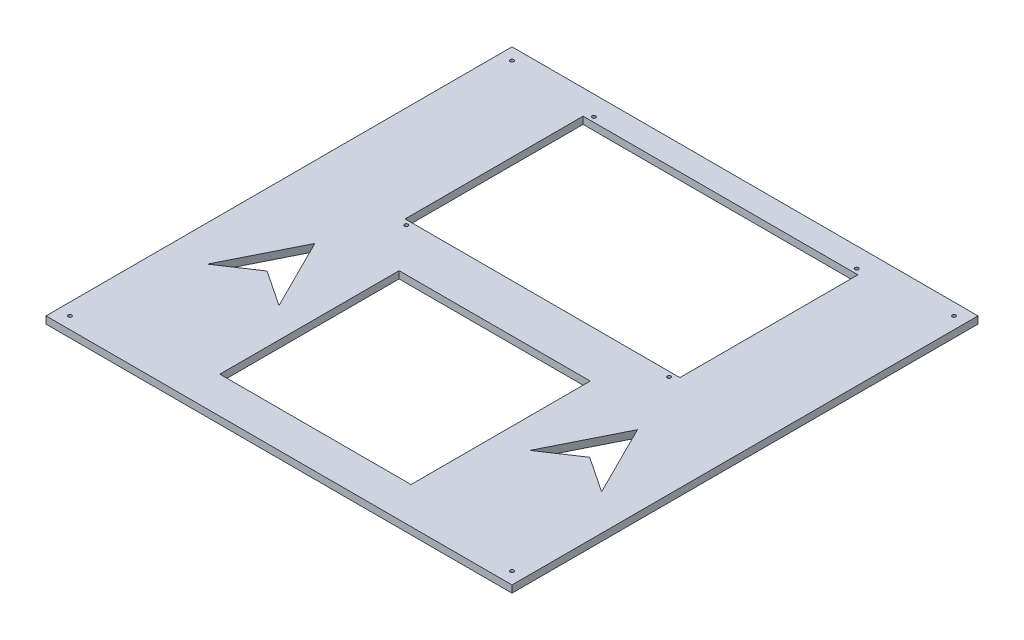
ISO-10303-21;
HEADER;
FILE_DESCRIPTION(('STEP AP214'),'2;1');
FILE_NAME('part.step','',(''),(''),'','','');
FILE_SCHEMA(('AUTOMOTIVE_DESIGN { 1 0 10303 214 1 1 1 1 }'));
ENDSEC;
DATA;
#1=APPLICATION_CONTEXT('core data for automotive mechanical design processes');
#2=APPLICATION_PROTOCOL_DEFINITION('international standard','automotive_design',2000,#1);
#3=PRODUCT_CONTEXT('',#1,'mechanical');
#4=PRODUCT('Part','Part','',(#3));
#5=PRODUCT_RELATED_PRODUCT_CATEGORY('part','',(#4));
#6=PRODUCT_DEFINITION_FORMATION('','',#4);
#7=PRODUCT_DEFINITION_CONTEXT('part definition',#1,'design');
#8=PRODUCT_DEFINITION('design','',#6,#7);
#9=PRODUCT_DEFINITION_SHAPE('','',#8);
#10=(LENGTH_UNIT() NAMED_UNIT(*) SI_UNIT(.MILLI.,.METRE.));
#11=(NAMED_UNIT(*) PLANE_ANGLE_UNIT() SI_UNIT($,.RADIAN.));
#12=(NAMED_UNIT(*) SI_UNIT($,.STERADIAN.) SOLID_ANGLE_UNIT());
#13=UNCERTAINTY_MEASURE_WITH_UNIT(LENGTH_MEASURE(1.E-05),#10,'distance_accuracy_value','');
#14=(GEOMETRIC_REPRESENTATION_CONTEXT(3) GLOBAL_UNCERTAINTY_ASSIGNED_CONTEXT((#13)) GLOBAL_UNIT_ASSIGNED_CONTEXT((#10,
#11,#12)) REPRESENTATION_CONTEXT('',''));
#15=CARTESIAN_POINT('',(0.,0.,0.));
#16=DIRECTION('',(0.,0.,1.));
#17=DIRECTION('',(1.,0.,0.));
#18=AXIS2_PLACEMENT_3D('',#15,#16,#17);
#19=CARTESIAN_POINT('',(0.,6.,0.));
#20=DIRECTION('',(0.,1.,0.));
#21=DIRECTION('',(0.,0.,1.));
#22=AXIS2_PLACEMENT_3D('',#19,#20,#21);
#23=PLANE('',#22);
#24=CARTESIAN_POINT('',(-185.,6.,185.));
#25=DIRECTION('',(0.,1.,0.));
#26=DIRECTION('',(0.,0.,1.));
#27=AXIS2_PLACEMENT_3D('',#24,#25,#26);
#28=CIRCLE('',#27,1.5);
#29=CARTESIAN_POINT('',(-185.,6.,186.5));
#30=VERTEX_POINT('',#29);
#31=EDGE_CURVE('E303',#30,#30,#28,.T.);
#32=ORIENTED_EDGE('',*,*,#31,.F.);
#33=EDGE_LOOP('',(#32));
#34=FACE_BOUND('',#33,.T.);
#35=CARTESIAN_POINT('',(-110.,6.,-21.5));
#36=DIRECTION('',(0.,1.,0.));
#37=DIRECTION('',(0.,0.,1.));
#38=AXIS2_PLACEMENT_3D('',#35,#36,#37);
#39=CIRCLE('',#38,1.5);
#40=CARTESIAN_POINT('',(-110.,6.,-20.));
#41=VERTEX_POINT('',#40);
#42=EDGE_CURVE('E304',#41,#41,#39,.T.);
#43=ORIENTED_EDGE('',*,*,#42,.F.);
#44=EDGE_LOOP('',(#43));
#45=FACE_BOUND('',#44,.T.);
#46=CARTESIAN_POINT('',(110.,6.,-21.5));
#47=DIRECTION('',(0.,1.,0.));
#48=DIRECTION('',(0.,0.,1.));
#49=AXIS2_PLACEMENT_3D('',#46,#47,#48);
#50=CIRCLE('',#49,1.5);
#51=CARTESIAN_POINT('',(110.,6.,-20.));
#52=VERTEX_POINT('',#51);
#53=EDGE_CURVE('E318',#52,#52,#50,.T.);
#54=ORIENTED_EDGE('',*,*,#53,.F.);
#55=EDGE_LOOP('',(#54));
#56=FACE_BOUND('',#55,.T.);
#57=CARTESIAN_POINT('',(185.,6.,185.));
#58=DIRECTION('',(0.,1.,0.));
#59=DIRECTION('',(0.,0.,1.));
#60=AXIS2_PLACEMENT_3D('',#57,#58,#59);
#61=CIRCLE('',#60,1.5);
#62=CARTESIAN_POINT('',(185.,6.,186.5));
#63=VERTEX_POINT('',#62);
#64=EDGE_CURVE('E547',#63,#63,#61,.T.);
#65=ORIENTED_EDGE('',*,*,#64,.F.);
#66=EDGE_LOOP('',(#65));
#67=FACE_BOUND('',#66,.T.);
#68=DIRECTION('',(1.,0.,0.));
#69=VECTOR('',#68,1.);
#70=CARTESIAN_POINT('',(-195.,6.,195.));
#71=LINE('',#70,#69);
#72=CARTESIAN_POINT('',(-195.,6.,195.));
#73=VERTEX_POINT('',#72);
#74=CARTESIAN_POINT('',(195.,6.,195.));
#75=VERTEX_POINT('',#74);
#76=EDGE_CURVE('E524',#73,#75,#71,.T.);
#77=ORIENTED_EDGE('',*,*,#76,.T.);
#78=DIRECTION('',(0.,0.,-1.));
#79=VECTOR('',#78,1.);
#80=CARTESIAN_POINT('',(195.,6.,195.));
#81=LINE('',#80,#79);
#82=CARTESIAN_POINT('',(195.,6.,-195.));
#83=VERTEX_POINT('',#82);
#84=EDGE_CURVE('E541',#75,#83,#81,.T.);
#85=ORIENTED_EDGE('',*,*,#84,.T.);
#86=DIRECTION('',(-1.,0.,0.));
#87=VECTOR('',#86,1.);
#88=CARTESIAN_POINT('',(195.,6.,-195.));
#89=LINE('',#88,#87);
#90=CARTESIAN_POINT('',(-195.,6.,-195.));
#91=VERTEX_POINT('',#90);
#92=EDGE_CURVE('E515',#83,#91,#89,.T.);
#93=ORIENTED_EDGE('',*,*,#92,.T.);
#94=DIRECTION('',(0.,0.,1.));
#95=VECTOR('',#94,1.);
#96=CARTESIAN_POINT('',(-195.,6.,-195.));
#97=LINE('',#96,#95);
#98=EDGE_CURVE('E532',#91,#73,#97,.T.);
#99=ORIENTED_EDGE('',*,*,#98,.T.);
#100=EDGE_LOOP('',(#77,#85,#93,#99));
#101=FACE_BOUND('',#100,.T.);
#102=CARTESIAN_POINT('',(-185.,6.,-185.));
#103=DIRECTION('',(0.,1.,0.));
#104=DIRECTION('',(0.,0.,1.));
#105=AXIS2_PLACEMENT_3D('',#102,#103,#104);
#106=CIRCLE('',#105,1.5);
#107=CARTESIAN_POINT('',(-185.,6.,-183.5));
#108=VERTEX_POINT('',#107);
#109=EDGE_CURVE('E332',#108,#108,#106,.T.);
#110=ORIENTED_EDGE('',*,*,#109,.F.);
#111=EDGE_LOOP('',(#110));
#112=FACE_BOUND('',#111,.T.);
#113=CARTESIAN_POINT('',(-110.,6.,-178.5));
#114=DIRECTION('',(0.,1.,0.));
#115=DIRECTION('',(0.,0.,1.));
#116=AXIS2_PLACEMENT_3D('',#113,#114,#115);
#117=CIRCLE('',#116,1.5);
#118=CARTESIAN_POINT('',(-110.,6.,-177.));
#119=VERTEX_POINT('',#118);
#120=EDGE_CURVE('E331',#119,#119,#117,.T.);
#121=ORIENTED_EDGE('',*,*,#120,.F.);
#122=EDGE_LOOP('',(#121));
#123=FACE_BOUND('',#122,.T.);
#124=DIRECTION('',(-1.,0.,0.));
#125=VECTOR('',#124,1.);
#126=CARTESIAN_POINT('',(115.,6.,-174.5));
#127=LINE('',#126,#125);
#128=CARTESIAN_POINT('',(115.,6.,-174.5));
#129=VERTEX_POINT('',#128);
#130=CARTESIAN_POINT('',(-115.,6.,-174.5));
#131=VERTEX_POINT('',#130);
#132=EDGE_CURVE('E437',#129,#131,#127,.T.);
#133=ORIENTED_EDGE('',*,*,#132,.F.);
#134=DIRECTION('',(0.,0.,-1.));
#135=VECTOR('',#134,1.);
#136=CARTESIAN_POINT('',(115.,6.,-25.5));
#137=LINE('',#136,#135);
#138=CARTESIAN_POINT('',(115.,6.,-25.5));
#139=VERTEX_POINT('',#138);
#140=EDGE_CURVE('E369',#139,#129,#137,.T.);
#141=ORIENTED_EDGE('',*,*,#140,.F.);
#142=DIRECTION('',(1.,0.,0.));
#143=VECTOR('',#142,1.);
#144=CARTESIAN_POINT('',(-115.,6.,-25.5));
#145=LINE('',#144,#143);
#146=CARTESIAN_POINT('',(-115.,6.,-25.5));
#147=VERTEX_POINT('',#146);
#148=EDGE_CURVE('E364',#147,#139,#145,.T.);
#149=ORIENTED_EDGE('',*,*,#148,.F.);
#150=DIRECTION('',(0.,0.,1.));
#151=VECTOR('',#150,1.);
#152=CARTESIAN_POINT('',(-115.,6.,-174.5));
#153=LINE('',#152,#151);
#154=EDGE_CURVE('E386',#131,#147,#153,.T.);
#155=ORIENTED_EDGE('',*,*,#154,.F.);
#156=EDGE_LOOP('',(#133,#141,#149,#155));
#157=FACE_BOUND('',#156,.T.);
#158=DIRECTION('',(1.,0.,0.));
#159=VECTOR('',#158,1.);
#160=CARTESIAN_POINT('',(-80.,6.,164.5));
#161=LINE('',#160,#159);
#162=CARTESIAN_POINT('',(-80.,6.,164.5));
#163=VERTEX_POINT('',#162);
#164=CARTESIAN_POINT('',(80.,6.,164.5));
#165=VERTEX_POINT('',#164);
#166=EDGE_CURVE('E394',#163,#165,#161,.T.);
#167=ORIENTED_EDGE('',*,*,#166,.F.);
#168=DIRECTION('',(0.,0.,1.));
#169=VECTOR('',#168,1.);
#170=CARTESIAN_POINT('',(-80.,6.,14.5000000000001));
#171=LINE('',#170,#169);
#172=CARTESIAN_POINT('',(-80.,6.,14.5000000000001));
#173=VERTEX_POINT('',#172);
#174=EDGE_CURVE('E398',#173,#163,#171,.T.);
#175=ORIENTED_EDGE('',*,*,#174,.F.);
#176=DIRECTION('',(-1.,0.,0.));
#177=VECTOR('',#176,1.);
#178=CARTESIAN_POINT('',(80.,6.,14.5000000000001));
#179=LINE('',#178,#177);
#180=CARTESIAN_POINT('',(80.,6.,14.5000000000001));
#181=VERTEX_POINT('',#180);
#182=EDGE_CURVE('E404',#181,#173,#179,.T.);
#183=ORIENTED_EDGE('',*,*,#182,.F.);
#184=DIRECTION('',(0.,0.,-1.));
#185=VECTOR('',#184,1.);
#186=CARTESIAN_POINT('',(80.,6.,14.5000000000001));
#187=LINE('',#186,#185);
#188=EDGE_CURVE('E397',#165,#181,#187,.T.);
#189=ORIENTED_EDGE('',*,*,#188,.F.);
#190=EDGE_LOOP('',(#167,#175,#183,#189));
#191=FACE_BOUND('',#190,.T.);
#192=CARTESIAN_POINT('',(110.,6.,-178.5));
#193=DIRECTION('',(0.,1.,0.));
#194=DIRECTION('',(0.,0.,1.));
#195=AXIS2_PLACEMENT_3D('',#192,#193,#194);
#196=CIRCLE('',#195,1.5);
#197=CARTESIAN_POINT('',(110.,6.,-177.));
#198=VERTEX_POINT('',#197);
#199=EDGE_CURVE('E292',#198,#198,#196,.T.);
#200=ORIENTED_EDGE('',*,*,#199,.F.);
#201=EDGE_LOOP('',(#200));
#202=FACE_BOUND('',#201,.T.);
#203=CARTESIAN_POINT('',(185.,6.,-185.));
#204=DIRECTION('',(0.,1.,0.));
#205=DIRECTION('',(0.,0.,1.));
#206=AXIS2_PLACEMENT_3D('',#203,#204,#205);
#207=CIRCLE('',#206,1.5);
#208=CARTESIAN_POINT('',(185.,6.,-183.5));
#209=VERTEX_POINT('',#208);
#210=EDGE_CURVE('E280',#209,#209,#207,.T.);
#211=ORIENTED_EDGE('',*,*,#210,.F.);
#212=EDGE_LOOP('',(#211));
#213=FACE_BOUND('',#212,.T.);
#214=DIRECTION('',(0.832050294337844,0.,0.554700196225229));
#215=VECTOR('',#214,1.);
#216=CARTESIAN_POINT('',(-135.,6.,70.));
#217=LINE('',#216,#215);
#218=CARTESIAN_POINT('',(-135.,6.,70.));
#219=VERTEX_POINT('',#218);
#220=CARTESIAN_POINT('',(-105.,6.,90.));
#221=VERTEX_POINT('',#220);
#222=EDGE_CURVE('E238',#219,#221,#217,.T.);
#223=ORIENTED_EDGE('',*,*,#222,.F.);
#224=DIRECTION('',(0.832050294337844,0.,-0.554700196225229));
#225=VECTOR('',#224,1.);
#226=CARTESIAN_POINT('',(-165.,6.,90.));
#227=LINE('',#226,#225);
#228=CARTESIAN_POINT('',(-165.,6.,90.));
#229=VERTEX_POINT('',#228);
#230=EDGE_CURVE('E234',#229,#219,#227,.T.);
#231=ORIENTED_EDGE('',*,*,#230,.F.);
#232=DIRECTION('',(-0.447213595499958,0.,0.894427190999916));
#233=VECTOR('',#232,1.);
#234=CARTESIAN_POINT('',(-135.,6.,30.));
#235=LINE('',#234,#233);
#236=CARTESIAN_POINT('',(-135.,6.,30.));
#237=VERTEX_POINT('',#236);
#238=EDGE_CURVE('E245',#237,#229,#235,.T.);
#239=ORIENTED_EDGE('',*,*,#238,.F.);
#240=DIRECTION('',(-0.447213595499958,0.,-0.894427190999916));
#241=VECTOR('',#240,1.);
#242=CARTESIAN_POINT('',(-105.,6.,90.));
#243=LINE('',#242,#241);
#244=EDGE_CURVE('E250',#221,#237,#243,.T.);
#245=ORIENTED_EDGE('',*,*,#244,.F.);
#246=EDGE_LOOP('',(#223,#231,#239,#245));
#247=FACE_BOUND('',#246,.T.);
#248=DIRECTION('',(0.832050294337844,0.,0.554700196225229));
#249=VECTOR('',#248,1.);
#250=CARTESIAN_POINT('',(135.,6.,70.));
#251=LINE('',#250,#249);
#252=CARTESIAN_POINT('',(135.,6.,70.));
#253=VERTEX_POINT('',#252);
#254=CARTESIAN_POINT('',(165.,6.,90.));
#255=VERTEX_POINT('',#254);
#256=EDGE_CURVE('E187',#253,#255,#251,.T.);
#257=ORIENTED_EDGE('',*,*,#256,.F.);
#258=DIRECTION('',(0.832050294337844,0.,-0.554700196225229));
#259=VECTOR('',#258,1.);
#260=CARTESIAN_POINT('',(105.,6.,90.));
#261=LINE('',#260,#259);
#262=CARTESIAN_POINT('',(105.,6.,90.));
#263=VERTEX_POINT('',#262);
#264=EDGE_CURVE('E178',#263,#253,#261,.T.);
#265=ORIENTED_EDGE('',*,*,#264,.F.);
#266=DIRECTION('',(-0.447213595499958,0.,0.894427190999916));
#267=VECTOR('',#266,1.);
#268=CARTESIAN_POINT('',(135.,6.,30.));
#269=LINE('',#268,#267);
#270=CARTESIAN_POINT('',(135.,6.,30.));
#271=VERTEX_POINT('',#270);
#272=EDGE_CURVE('E204',#271,#263,#269,.T.);
#273=ORIENTED_EDGE('',*,*,#272,.F.);
#274=DIRECTION('',(-0.447213595499958,0.,-0.894427190999916));
#275=VECTOR('',#274,1.);
#276=CARTESIAN_POINT('',(165.,6.,90.));
#277=LINE('',#276,#275);
#278=EDGE_CURVE('E200',#255,#271,#277,.T.);
#279=ORIENTED_EDGE('',*,*,#278,.F.);
#280=EDGE_LOOP('',(#257,#265,#273,#279));
#281=FACE_BOUND('',#280,.T.);
#282=ADVANCED_FACE('F40',(#34,#45,#56,#67,#101,#112,#123,#157,#191,#202,#213,#247,#281),#23,.T.);
#283=CARTESIAN_POINT('',(0.,0.,0.));
#284=DIRECTION('',(0.,1.,0.));
#285=DIRECTION('',(0.,0.,1.));
#286=AXIS2_PLACEMENT_3D('',#283,#284,#285);
#287=PLANE('',#286);
#288=DIRECTION('',(0.832050294337844,0.,-0.554700196225229));
#289=VECTOR('',#288,1.);
#290=CARTESIAN_POINT('',(-165.,0.,90.));
#291=LINE('',#290,#289);
#292=CARTESIAN_POINT('',(-165.,0.,90.));
#293=VERTEX_POINT('',#292);
#294=CARTESIAN_POINT('',(-135.,0.,70.));
#295=VERTEX_POINT('',#294);
#296=EDGE_CURVE('E196',#293,#295,#291,.T.);
#297=ORIENTED_EDGE('',*,*,#296,.T.);
#298=DIRECTION('',(0.832050294337844,0.,0.554700196225229));
#299=VECTOR('',#298,1.);
#300=CARTESIAN_POINT('',(-135.,0.,70.));
#301=LINE('',#300,#299);
#302=CARTESIAN_POINT('',(-105.,0.,90.));
#303=VERTEX_POINT('',#302);
#304=EDGE_CURVE('E255',#295,#303,#301,.T.);
#305=ORIENTED_EDGE('',*,*,#304,.T.);
#306=DIRECTION('',(-0.447213595499958,0.,-0.894427190999916));
#307=VECTOR('',#306,1.);
#308=CARTESIAN_POINT('',(-105.,0.,90.));
#309=LINE('',#308,#307);
#310=CARTESIAN_POINT('',(-135.,0.,30.));
#311=VERTEX_POINT('',#310);
#312=EDGE_CURVE('E259',#303,#311,#309,.T.);
#313=ORIENTED_EDGE('',*,*,#312,.T.);
#314=DIRECTION('',(-0.447213595499958,0.,0.894427190999916));
#315=VECTOR('',#314,1.);
#316=CARTESIAN_POINT('',(-135.,0.,30.));
#317=LINE('',#316,#315);
#318=EDGE_CURVE('E239',#311,#293,#317,.T.);
#319=ORIENTED_EDGE('',*,*,#318,.T.);
#320=EDGE_LOOP('',(#297,#305,#313,#319));
#321=FACE_BOUND('',#320,.T.);
#322=DIRECTION('',(0.,0.,-1.));
#323=VECTOR('',#322,1.);
#324=CARTESIAN_POINT('',(115.,0.,-25.5));
#325=LINE('',#324,#323);
#326=CARTESIAN_POINT('',(115.,0.,-25.5));
#327=VERTEX_POINT('',#326);
#328=CARTESIAN_POINT('',(115.,0.,-174.5));
#329=VERTEX_POINT('',#328);
#330=EDGE_CURVE('E378',#327,#329,#325,.T.);
#331=ORIENTED_EDGE('',*,*,#330,.T.);
#332=DIRECTION('',(-1.,0.,0.));
#333=VECTOR('',#332,1.);
#334=CARTESIAN_POINT('',(115.,0.,-174.5));
#335=LINE('',#334,#333);
#336=CARTESIAN_POINT('',(-115.,0.,-174.5));
#337=VERTEX_POINT('',#336);
#338=EDGE_CURVE('E374',#329,#337,#335,.T.);
#339=ORIENTED_EDGE('',*,*,#338,.T.);
#340=DIRECTION('',(0.,0.,1.));
#341=VECTOR('',#340,1.);
#342=CARTESIAN_POINT('',(-115.,0.,-174.5));
#343=LINE('',#342,#341);
#344=CARTESIAN_POINT('',(-115.,0.,-25.5));
#345=VERTEX_POINT('',#344);
#346=EDGE_CURVE('E370',#337,#345,#343,.T.);
#347=ORIENTED_EDGE('',*,*,#346,.T.);
#348=DIRECTION('',(1.,0.,0.));
#349=VECTOR('',#348,1.);
#350=CARTESIAN_POINT('',(-115.,0.,-25.5));
#351=LINE('',#350,#349);
#352=EDGE_CURVE('E365',#345,#327,#351,.T.);
#353=ORIENTED_EDGE('',*,*,#352,.T.);
#354=EDGE_LOOP('',(#331,#339,#347,#353));
#355=FACE_BOUND('',#354,.T.);
#356=DIRECTION('',(1.,0.,0.));
#357=VECTOR('',#356,1.);
#358=CARTESIAN_POINT('',(-195.,0.,195.));
#359=LINE('',#358,#357);
#360=CARTESIAN_POINT('',(-195.,0.,195.));
#361=VERTEX_POINT('',#360);
#362=CARTESIAN_POINT('',(195.,0.,195.));
#363=VERTEX_POINT('',#362);
#364=EDGE_CURVE('E511',#361,#363,#359,.T.);
#365=ORIENTED_EDGE('',*,*,#364,.F.);
#366=DIRECTION('',(0.,0.,1.));
#367=VECTOR('',#366,1.);
#368=CARTESIAN_POINT('',(-195.,0.,-195.));
#369=LINE('',#368,#367);
#370=CARTESIAN_POINT('',(-195.,0.,-195.));
#371=VERTEX_POINT('',#370);
#372=EDGE_CURVE('E520',#371,#361,#369,.T.);
#373=ORIENTED_EDGE('',*,*,#372,.F.);
#374=DIRECTION('',(-1.,0.,0.));
#375=VECTOR('',#374,1.);
#376=CARTESIAN_POINT('',(195.,0.,-195.));
#377=LINE('',#376,#375);
#378=CARTESIAN_POINT('',(195.,0.,-195.));
#379=VERTEX_POINT('',#378);
#380=EDGE_CURVE('E510',#379,#371,#377,.T.);
#381=ORIENTED_EDGE('',*,*,#380,.F.);
#382=DIRECTION('',(0.,0.,-1.));
#383=VECTOR('',#382,1.);
#384=CARTESIAN_POINT('',(195.,0.,195.));
#385=LINE('',#384,#383);
#386=EDGE_CURVE('E502',#363,#379,#385,.T.);
#387=ORIENTED_EDGE('',*,*,#386,.F.);
#388=EDGE_LOOP('',(#365,#373,#381,#387));
#389=FACE_BOUND('',#388,.T.);
#390=CARTESIAN_POINT('',(185.,0.,185.));
#391=DIRECTION('',(0.,1.,0.));
#392=DIRECTION('',(0.,0.,1.));
#393=AXIS2_PLACEMENT_3D('',#390,#391,#392);
#394=CIRCLE('',#393,1.5);
#395=CARTESIAN_POINT('',(185.,0.,186.5));
#396=VERTEX_POINT('',#395);
#397=EDGE_CURVE('E337',#396,#396,#394,.T.);
#398=ORIENTED_EDGE('',*,*,#397,.T.);
#399=EDGE_LOOP('',(#398));
#400=FACE_BOUND('',#399,.T.);
#401=CARTESIAN_POINT('',(-185.,0.,-185.));
#402=DIRECTION('',(0.,1.,0.));
#403=DIRECTION('',(0.,0.,1.));
#404=AXIS2_PLACEMENT_3D('',#401,#402,#403);
#405=CIRCLE('',#404,1.5);
#406=CARTESIAN_POINT('',(-185.,0.,-183.5));
#407=VERTEX_POINT('',#406);
#408=EDGE_CURVE('E324',#407,#407,#405,.T.);
#409=ORIENTED_EDGE('',*,*,#408,.T.);
#410=EDGE_LOOP('',(#409));
#411=FACE_BOUND('',#410,.T.);
#412=CARTESIAN_POINT('',(110.,0.,-21.5));
#413=DIRECTION('',(0.,1.,0.));
#414=DIRECTION('',(0.,0.,1.));
#415=AXIS2_PLACEMENT_3D('',#412,#413,#414);
#416=CIRCLE('',#415,1.5);
#417=CARTESIAN_POINT('',(110.,0.,-20.));
#418=VERTEX_POINT('',#417);
#419=EDGE_CURVE('E325',#418,#418,#416,.T.);
#420=ORIENTED_EDGE('',*,*,#419,.T.);
#421=EDGE_LOOP('',(#420));
#422=FACE_BOUND('',#421,.T.);
#423=CARTESIAN_POINT('',(-110.,0.,-178.5));
#424=DIRECTION('',(0.,1.,0.));
#425=DIRECTION('',(0.,0.,1.));
#426=AXIS2_PLACEMENT_3D('',#423,#424,#425);
#427=CIRCLE('',#426,1.5);
#428=CARTESIAN_POINT('',(-110.,0.,-177.));
#429=VERTEX_POINT('',#428);
#430=EDGE_CURVE('E326',#429,#429,#427,.T.);
#431=ORIENTED_EDGE('',*,*,#430,.T.);
#432=EDGE_LOOP('',(#431));
#433=FACE_BOUND('',#432,.T.);
#434=DIRECTION('',(0.,0.,1.));
#435=VECTOR('',#434,1.);
#436=CARTESIAN_POINT('',(-80.,0.,14.5000000000001));
#437=LINE('',#436,#435);
#438=CARTESIAN_POINT('',(-80.,0.,14.5000000000001));
#439=VERTEX_POINT('',#438);
#440=CARTESIAN_POINT('',(-80.,0.,164.5));
#441=VERTEX_POINT('',#440);
#442=EDGE_CURVE('E309',#439,#441,#437,.T.);
#443=ORIENTED_EDGE('',*,*,#442,.T.);
#444=DIRECTION('',(1.,0.,0.));
#445=VECTOR('',#444,1.);
#446=CARTESIAN_POINT('',(-80.,0.,164.5));
#447=LINE('',#446,#445);
#448=CARTESIAN_POINT('',(80.,0.,164.5));
#449=VERTEX_POINT('',#448);
#450=EDGE_CURVE('E412',#441,#449,#447,.T.);
#451=ORIENTED_EDGE('',*,*,#450,.T.);
#452=DIRECTION('',(0.,0.,-1.));
#453=VECTOR('',#452,1.);
#454=CARTESIAN_POINT('',(80.,0.,14.5000000000001));
#455=LINE('',#454,#453);
#456=CARTESIAN_POINT('',(80.,0.,14.5000000000001));
#457=VERTEX_POINT('',#456);
#458=EDGE_CURVE('E416',#449,#457,#455,.T.);
#459=ORIENTED_EDGE('',*,*,#458,.T.);
#460=DIRECTION('',(-1.,0.,0.));
#461=VECTOR('',#460,1.);
#462=CARTESIAN_POINT('',(80.,0.,14.5000000000001));
#463=LINE('',#462,#461);
#464=EDGE_CURVE('E420',#457,#439,#463,.T.);
#465=ORIENTED_EDGE('',*,*,#464,.T.);
#466=EDGE_LOOP('',(#443,#451,#459,#465));
#467=FACE_BOUND('',#466,.T.);
#468=CARTESIAN_POINT('',(-110.,0.,-21.5));
#469=DIRECTION('',(0.,1.,0.));
#470=DIRECTION('',(0.,0.,1.));
#471=AXIS2_PLACEMENT_3D('',#468,#469,#470);
#472=CIRCLE('',#471,1.5);
#473=CARTESIAN_POINT('',(-110.,0.,-20.));
#474=VERTEX_POINT('',#473);
#475=EDGE_CURVE('E298',#474,#474,#472,.T.);
#476=ORIENTED_EDGE('',*,*,#475,.T.);
#477=EDGE_LOOP('',(#476));
#478=FACE_BOUND('',#477,.T.);
#479=CARTESIAN_POINT('',(110.,0.,-178.5));
#480=DIRECTION('',(0.,1.,0.));
#481=DIRECTION('',(0.,0.,1.));
#482=AXIS2_PLACEMENT_3D('',#479,#480,#481);
#483=CIRCLE('',#482,1.5);
#484=CARTESIAN_POINT('',(110.,0.,-177.));
#485=VERTEX_POINT('',#484);
#486=EDGE_CURVE('E299',#485,#485,#483,.T.);
#487=ORIENTED_EDGE('',*,*,#486,.T.);
#488=EDGE_LOOP('',(#487));
#489=FACE_BOUND('',#488,.T.);
#490=CARTESIAN_POINT('',(-185.,0.,185.));
#491=DIRECTION('',(0.,1.,0.));
#492=DIRECTION('',(0.,0.,1.));
#493=AXIS2_PLACEMENT_3D('',#490,#491,#492);
#494=CIRCLE('',#493,1.5);
#495=CARTESIAN_POINT('',(-185.,0.,186.5));
#496=VERTEX_POINT('',#495);
#497=EDGE_CURVE('E285',#496,#496,#494,.T.);
#498=ORIENTED_EDGE('',*,*,#497,.T.);
#499=EDGE_LOOP('',(#498));
#500=FACE_BOUND('',#499,.T.);
#501=CARTESIAN_POINT('',(185.,0.,-185.));
#502=DIRECTION('',(0.,1.,0.));
#503=DIRECTION('',(0.,0.,1.));
#504=AXIS2_PLACEMENT_3D('',#501,#502,#503);
#505=CIRCLE('',#504,1.5);
#506=CARTESIAN_POINT('',(185.,0.,-183.5));
#507=VERTEX_POINT('',#506);
#508=EDGE_CURVE('E279',#507,#507,#505,.T.);
#509=ORIENTED_EDGE('',*,*,#508,.T.);
#510=EDGE_LOOP('',(#509));
#511=FACE_BOUND('',#510,.T.);
#512=DIRECTION('',(0.832050294337844,0.,-0.554700196225229));
#513=VECTOR('',#512,1.);
#514=CARTESIAN_POINT('',(105.,0.,90.));
#515=LINE('',#514,#513);
#516=CARTESIAN_POINT('',(105.,0.,90.));
#517=VERTEX_POINT('',#516);
#518=CARTESIAN_POINT('',(135.,0.,70.));
#519=VERTEX_POINT('',#518);
#520=EDGE_CURVE('E64',#517,#519,#515,.T.);
#521=ORIENTED_EDGE('',*,*,#520,.T.);
#522=DIRECTION('',(0.832050294337844,0.,0.554700196225229));
#523=VECTOR('',#522,1.);
#524=CARTESIAN_POINT('',(135.,0.,70.));
#525=LINE('',#524,#523);
#526=CARTESIAN_POINT('',(165.,0.,90.));
#527=VERTEX_POINT('',#526);
#528=EDGE_CURVE('E194',#519,#527,#525,.T.);
#529=ORIENTED_EDGE('',*,*,#528,.T.);
#530=DIRECTION('',(-0.447213595499958,0.,-0.894427190999916));
#531=VECTOR('',#530,1.);
#532=CARTESIAN_POINT('',(165.,0.,90.));
#533=LINE('',#532,#531);
#534=CARTESIAN_POINT('',(135.,0.,30.));
#535=VERTEX_POINT('',#534);
#536=EDGE_CURVE('E221',#527,#535,#533,.T.);
#537=ORIENTED_EDGE('',*,*,#536,.T.);
#538=DIRECTION('',(-0.447213595499958,0.,0.894427190999916));
#539=VECTOR('',#538,1.);
#540=CARTESIAN_POINT('',(135.,0.,30.));
#541=LINE('',#540,#539);
#542=EDGE_CURVE('E188',#535,#517,#541,.T.);
#543=ORIENTED_EDGE('',*,*,#542,.T.);
#544=EDGE_LOOP('',(#521,#529,#537,#543));
#545=FACE_BOUND('',#544,.T.);
#546=ADVANCED_FACE('F461',(#321,#355,#389,#400,#411,#422,#433,#467,#478,#489,#500,#511,#545),
#287,.F.);
#547=CARTESIAN_POINT('',(-195.,6.,195.));
#548=DIRECTION('',(0.,0.,-1.));
#549=DIRECTION('',(-1.,0.,0.));
#550=AXIS2_PLACEMENT_3D('',#547,#548,#549);
#551=PLANE('',#550);
#552=ORIENTED_EDGE('',*,*,#364,.T.);
#553=DIRECTION('',(0.,-1.,0.));
#554=VECTOR('',#553,1.);
#555=CARTESIAN_POINT('',(195.,6.,195.));
#556=LINE('',#555,#554);
#557=EDGE_CURVE('E12',#75,#363,#556,.T.);
#558=ORIENTED_EDGE('',*,*,#557,.F.);
#559=ORIENTED_EDGE('',*,*,#76,.F.);
#560=DIRECTION('',(0.,-1.,0.));
#561=VECTOR('',#560,1.);
#562=CARTESIAN_POINT('',(-195.,6.,195.));
#563=LINE('',#562,#561);
#564=EDGE_CURVE('E528',#73,#361,#563,.T.);
#565=ORIENTED_EDGE('',*,*,#564,.T.);
#566=EDGE_LOOP('',(#552,#558,#559,#565));
#567=FACE_BOUND('',#566,.T.);
#568=ADVANCED_FACE('F42',(#567),#551,.F.);
#569=CARTESIAN_POINT('',(195.,6.,195.));
#570=DIRECTION('',(-1.,0.,0.));
#571=DIRECTION('',(0.,0.,1.));
#572=AXIS2_PLACEMENT_3D('',#569,#570,#571);
#573=PLANE('',#572);
#574=ORIENTED_EDGE('',*,*,#386,.T.);
#575=DIRECTION('',(0.,-1.,0.));
#576=VECTOR('',#575,1.);
#577=CARTESIAN_POINT('',(195.,6.,-195.));
#578=LINE('',#577,#576);
#579=EDGE_CURVE('E49',#83,#379,#578,.T.);
#580=ORIENTED_EDGE('',*,*,#579,.F.);
#581=ORIENTED_EDGE('',*,*,#84,.F.);
#582=ORIENTED_EDGE('',*,*,#557,.T.);
#583=EDGE_LOOP('',(#574,#580,#581,#582));
#584=FACE_BOUND('',#583,.T.);
#585=ADVANCED_FACE('F493',(#584),#573,.F.);
#586=CARTESIAN_POINT('',(195.,6.,-195.));
#587=DIRECTION('',(0.,0.,1.));
#588=DIRECTION('',(1.,0.,0.));
#589=AXIS2_PLACEMENT_3D('',#586,#587,#588);
#590=PLANE('',#589);
#591=ORIENTED_EDGE('',*,*,#380,.T.);
#592=DIRECTION('',(0.,-1.,0.));
#593=VECTOR('',#592,1.);
#594=CARTESIAN_POINT('',(-195.,6.,-195.));
#595=LINE('',#594,#593);
#596=EDGE_CURVE('E517',#91,#371,#595,.T.);
#597=ORIENTED_EDGE('',*,*,#596,.F.);
#598=ORIENTED_EDGE('',*,*,#92,.F.);
#599=ORIENTED_EDGE('',*,*,#579,.T.);
#600=EDGE_LOOP('',(#591,#597,#598,#599));
#601=FACE_BOUND('',#600,.T.);
#602=ADVANCED_FACE('F490',(#601),#590,.F.);
#603=CARTESIAN_POINT('',(-195.,6.,-195.));
#604=DIRECTION('',(1.,0.,0.));
#605=DIRECTION('',(0.,0.,-1.));
#606=AXIS2_PLACEMENT_3D('',#603,#604,#605);
#607=PLANE('',#606);
#608=ORIENTED_EDGE('',*,*,#372,.T.);
#609=ORIENTED_EDGE('',*,*,#564,.F.);
#610=ORIENTED_EDGE('',*,*,#98,.F.);
#611=ORIENTED_EDGE('',*,*,#596,.T.);
#612=EDGE_LOOP('',(#608,#609,#610,#611));
#613=FACE_BOUND('',#612,.T.);
#614=ADVANCED_FACE('F487',(#613),#607,.F.);
#615=CARTESIAN_POINT('',(185.,6.,185.));
#616=DIRECTION('',(0.,-1.,0.));
#617=DIRECTION('',(0.,0.,-1.));
#618=AXIS2_PLACEMENT_3D('',#615,#616,#617);
#619=CYLINDRICAL_SURFACE('',#618,1.5);
#620=ORIENTED_EDGE('',*,*,#64,.T.);
#621=EDGE_LOOP('',(#620));
#622=FACE_BOUND('',#621,.T.);
#623=ORIENTED_EDGE('',*,*,#397,.F.);
#624=EDGE_LOOP('',(#623));
#625=FACE_BOUND('',#624,.T.);
#626=ADVANCED_FACE('F484',(#622,#625),#619,.F.);
#627=CARTESIAN_POINT('',(-185.,6.,-185.));
#628=DIRECTION('',(0.,-1.,0.));
#629=DIRECTION('',(0.,0.,-1.));
#630=AXIS2_PLACEMENT_3D('',#627,#628,#629);
#631=CYLINDRICAL_SURFACE('',#630,1.5);
#632=ORIENTED_EDGE('',*,*,#109,.T.);
#633=EDGE_LOOP('',(#632));
#634=FACE_BOUND('',#633,.T.);
#635=ORIENTED_EDGE('',*,*,#408,.F.);
#636=EDGE_LOOP('',(#635));
#637=FACE_BOUND('',#636,.T.);
#638=ADVANCED_FACE('F581',(#634,#637),#631,.F.);
#639=CARTESIAN_POINT('',(110.,6.,-21.5));
#640=DIRECTION('',(0.,-1.,0.));
#641=DIRECTION('',(0.,0.,-1.));
#642=AXIS2_PLACEMENT_3D('',#639,#640,#641);
#643=CYLINDRICAL_SURFACE('',#642,1.5);
#644=ORIENTED_EDGE('',*,*,#53,.T.);
#645=EDGE_LOOP('',(#644));
#646=FACE_BOUND('',#645,.T.);
#647=ORIENTED_EDGE('',*,*,#419,.F.);
#648=EDGE_LOOP('',(#647));
#649=FACE_BOUND('',#648,.T.);
#650=ADVANCED_FACE('F569',(#646,#649),#643,.F.);
#651=CARTESIAN_POINT('',(-110.,6.,-178.5));
#652=DIRECTION('',(0.,-1.,0.));
#653=DIRECTION('',(0.,0.,-1.));
#654=AXIS2_PLACEMENT_3D('',#651,#652,#653);
#655=CYLINDRICAL_SURFACE('',#654,1.5);
#656=ORIENTED_EDGE('',*,*,#120,.T.);
#657=EDGE_LOOP('',(#656));
#658=FACE_BOUND('',#657,.T.);
#659=ORIENTED_EDGE('',*,*,#430,.F.);
#660=EDGE_LOOP('',(#659));
#661=FACE_BOUND('',#660,.T.);
#662=ADVANCED_FACE('F471',(#658,#661),#655,.F.);
#663=CARTESIAN_POINT('',(115.,6.,-25.5));
#664=DIRECTION('',(-1.,0.,0.));
#665=DIRECTION('',(0.,0.,1.));
#666=AXIS2_PLACEMENT_3D('',#663,#664,#665);
#667=PLANE('',#666);
#668=ORIENTED_EDGE('',*,*,#330,.F.);
#669=DIRECTION('',(0.,-1.,0.));
#670=VECTOR('',#669,1.);
#671=CARTESIAN_POINT('',(115.,6.,-25.5));
#672=LINE('',#671,#670);
#673=EDGE_CURVE('E360',#139,#327,#672,.T.);
#674=ORIENTED_EDGE('',*,*,#673,.F.);
#675=ORIENTED_EDGE('',*,*,#140,.T.);
#676=DIRECTION('',(0.,-1.,0.));
#677=VECTOR('',#676,1.);
#678=CARTESIAN_POINT('',(115.,6.,-174.5));
#679=LINE('',#678,#677);
#680=EDGE_CURVE('E350',#129,#329,#679,.T.);
#681=ORIENTED_EDGE('',*,*,#680,.T.);
#682=EDGE_LOOP('',(#668,#674,#675,#681));
#683=FACE_BOUND('',#682,.T.);
#684=ADVANCED_FACE('F459',(#683),#667,.T.);
#685=CARTESIAN_POINT('',(115.,6.,-174.5));
#686=DIRECTION('',(0.,0.,1.));
#687=DIRECTION('',(1.,0.,0.));
#688=AXIS2_PLACEMENT_3D('',#685,#686,#687);
#689=PLANE('',#688);
#690=ORIENTED_EDGE('',*,*,#338,.F.);
#691=ORIENTED_EDGE('',*,*,#680,.F.);
#692=ORIENTED_EDGE('',*,*,#132,.T.);
#693=DIRECTION('',(0.,-1.,0.));
#694=VECTOR('',#693,1.);
#695=CARTESIAN_POINT('',(-115.,6.,-174.5));
#696=LINE('',#695,#694);
#697=EDGE_CURVE('E354',#131,#337,#696,.T.);
#698=ORIENTED_EDGE('',*,*,#697,.T.);
#699=EDGE_LOOP('',(#690,#691,#692,#698));
#700=FACE_BOUND('',#699,.T.);
#701=ADVANCED_FACE('F463',(#700),#689,.T.);
#702=CARTESIAN_POINT('',(-115.,6.,-174.5));
#703=DIRECTION('',(1.,0.,0.));
#704=DIRECTION('',(0.,0.,-1.));
#705=AXIS2_PLACEMENT_3D('',#702,#703,#704);
#706=PLANE('',#705);
#707=ORIENTED_EDGE('',*,*,#346,.F.);
#708=ORIENTED_EDGE('',*,*,#697,.F.);
#709=ORIENTED_EDGE('',*,*,#154,.T.);
#710=DIRECTION('',(0.,-1.,0.));
#711=VECTOR('',#710,1.);
#712=CARTESIAN_POINT('',(-115.,6.,-25.5));
#713=LINE('',#712,#711);
#714=EDGE_CURVE('E357',#147,#345,#713,.T.);
#715=ORIENTED_EDGE('',*,*,#714,.T.);
#716=EDGE_LOOP('',(#707,#708,#709,#715));
#717=FACE_BOUND('',#716,.T.);
#718=ADVANCED_FACE('F450',(#717),#706,.T.);
#719=CARTESIAN_POINT('',(-115.,6.,-25.5));
#720=DIRECTION('',(0.,0.,-1.));
#721=DIRECTION('',(-1.,0.,0.));
#722=AXIS2_PLACEMENT_3D('',#719,#720,#721);
#723=PLANE('',#722);
#724=ORIENTED_EDGE('',*,*,#352,.F.);
#725=ORIENTED_EDGE('',*,*,#714,.F.);
#726=ORIENTED_EDGE('',*,*,#148,.T.);
#727=ORIENTED_EDGE('',*,*,#673,.T.);
#728=EDGE_LOOP('',(#724,#725,#726,#727));
#729=FACE_BOUND('',#728,.T.);
#730=ADVANCED_FACE('F457',(#729),#723,.T.);
#731=CARTESIAN_POINT('',(-80.,6.,14.5000000000001));
#732=DIRECTION('',(1.,0.,0.));
#733=DIRECTION('',(0.,0.,-1.));
#734=AXIS2_PLACEMENT_3D('',#731,#732,#733);
#735=PLANE('',#734);
#736=ORIENTED_EDGE('',*,*,#442,.F.);
#737=DIRECTION('',(0.,-1.,0.));
#738=VECTOR('',#737,1.);
#739=CARTESIAN_POINT('',(-80.,6.,14.5000000000001));
#740=LINE('',#739,#738);
#741=EDGE_CURVE('E408',#173,#439,#740,.T.);
#742=ORIENTED_EDGE('',*,*,#741,.F.);
#743=ORIENTED_EDGE('',*,*,#174,.T.);
#744=DIRECTION('',(0.,-1.,0.));
#745=VECTOR('',#744,1.);
#746=CARTESIAN_POINT('',(-80.,6.,164.5));
#747=LINE('',#746,#745);
#748=EDGE_CURVE('E382',#163,#441,#747,.T.);
#749=ORIENTED_EDGE('',*,*,#748,.T.);
#750=EDGE_LOOP('',(#736,#742,#743,#749));
#751=FACE_BOUND('',#750,.T.);
#752=ADVANCED_FACE('F664',(#751),#735,.T.);
#753=CARTESIAN_POINT('',(-80.,6.,164.5));
#754=DIRECTION('',(0.,0.,-1.));
#755=DIRECTION('',(-1.,0.,0.));
#756=AXIS2_PLACEMENT_3D('',#753,#754,#755);
#757=PLANE('',#756);
#758=ORIENTED_EDGE('',*,*,#450,.F.);
#759=ORIENTED_EDGE('',*,*,#748,.F.);
#760=ORIENTED_EDGE('',*,*,#166,.T.);
#761=DIRECTION('',(0.,-1.,0.));
#762=VECTOR('',#761,1.);
#763=CARTESIAN_POINT('',(80.,6.,164.5));
#764=LINE('',#763,#762);
#765=EDGE_CURVE('E430',#165,#449,#764,.T.);
#766=ORIENTED_EDGE('',*,*,#765,.T.);
#767=EDGE_LOOP('',(#758,#759,#760,#766));
#768=FACE_BOUND('',#767,.T.);
#769=ADVANCED_FACE('F672',(#768),#757,.T.);
#770=CARTESIAN_POINT('',(80.,6.,14.5000000000001));
#771=DIRECTION('',(-1.,0.,0.));
#772=DIRECTION('',(0.,0.,1.));
#773=AXIS2_PLACEMENT_3D('',#770,#771,#772);
#774=PLANE('',#773);
#775=ORIENTED_EDGE('',*,*,#458,.F.);
#776=ORIENTED_EDGE('',*,*,#765,.F.);
#777=ORIENTED_EDGE('',*,*,#188,.T.);
#778=DIRECTION('',(0.,-1.,0.));
#779=VECTOR('',#778,1.);
#780=CARTESIAN_POINT('',(80.,6.,14.5000000000001));
#781=LINE('',#780,#779);
#782=EDGE_CURVE('E427',#181,#457,#781,.T.);
#783=ORIENTED_EDGE('',*,*,#782,.T.);
#784=EDGE_LOOP('',(#775,#776,#777,#783));
#785=FACE_BOUND('',#784,.T.);
#786=ADVANCED_FACE('F681',(#785),#774,.T.);
#787=CARTESIAN_POINT('',(80.,6.,14.5000000000001));
#788=DIRECTION('',(0.,0.,1.));
#789=DIRECTION('',(1.,0.,0.));
#790=AXIS2_PLACEMENT_3D('',#787,#788,#789);
#791=PLANE('',#790);
#792=ORIENTED_EDGE('',*,*,#464,.F.);
#793=ORIENTED_EDGE('',*,*,#782,.F.);
#794=ORIENTED_EDGE('',*,*,#182,.T.);
#795=ORIENTED_EDGE('',*,*,#741,.T.);
#796=EDGE_LOOP('',(#792,#793,#794,#795));
#797=FACE_BOUND('',#796,.T.);
#798=ADVANCED_FACE('F690',(#797),#791,.T.);
#799=CARTESIAN_POINT('',(-110.,6.,-21.5));
#800=DIRECTION('',(0.,-1.,0.));
#801=DIRECTION('',(0.,0.,-1.));
#802=AXIS2_PLACEMENT_3D('',#799,#800,#801);
#803=CYLINDRICAL_SURFACE('',#802,1.5);
#804=ORIENTED_EDGE('',*,*,#42,.T.);
#805=EDGE_LOOP('',(#804));
#806=FACE_BOUND('',#805,.T.);
#807=ORIENTED_EDGE('',*,*,#475,.F.);
#808=EDGE_LOOP('',(#807));
#809=FACE_BOUND('',#808,.T.);
#810=ADVANCED_FACE('F699',(#806,#809),#803,.F.);
#811=CARTESIAN_POINT('',(110.,6.,-178.5));
#812=DIRECTION('',(0.,-1.,0.));
#813=DIRECTION('',(0.,0.,-1.));
#814=AXIS2_PLACEMENT_3D('',#811,#812,#813);
#815=CYLINDRICAL_SURFACE('',#814,1.5);
#816=ORIENTED_EDGE('',*,*,#199,.T.);
#817=EDGE_LOOP('',(#816));
#818=FACE_BOUND('',#817,.T.);
#819=ORIENTED_EDGE('',*,*,#486,.F.);
#820=EDGE_LOOP('',(#819));
#821=FACE_BOUND('',#820,.T.);
#822=ADVANCED_FACE('F708',(#818,#821),#815,.F.);
#823=CARTESIAN_POINT('',(-185.,6.,185.));
#824=DIRECTION('',(0.,-1.,0.));
#825=DIRECTION('',(0.,0.,-1.));
#826=AXIS2_PLACEMENT_3D('',#823,#824,#825);
#827=CYLINDRICAL_SURFACE('',#826,1.5);
#828=ORIENTED_EDGE('',*,*,#31,.T.);
#829=EDGE_LOOP('',(#828));
#830=FACE_BOUND('',#829,.T.);
#831=ORIENTED_EDGE('',*,*,#497,.F.);
#832=EDGE_LOOP('',(#831));
#833=FACE_BOUND('',#832,.T.);
#834=ADVANCED_FACE('F717',(#830,#833),#827,.F.);
#835=CARTESIAN_POINT('',(185.,6.,-185.));
#836=DIRECTION('',(0.,-1.,0.));
#837=DIRECTION('',(0.,0.,-1.));
#838=AXIS2_PLACEMENT_3D('',#835,#836,#837);
#839=CYLINDRICAL_SURFACE('',#838,1.5);
#840=ORIENTED_EDGE('',*,*,#210,.T.);
#841=EDGE_LOOP('',(#840));
#842=FACE_BOUND('',#841,.T.);
#843=ORIENTED_EDGE('',*,*,#508,.F.);
#844=EDGE_LOOP('',(#843));
#845=FACE_BOUND('',#844,.T.);
#846=ADVANCED_FACE('F726',(#842,#845),#839,.F.);
#847=CARTESIAN_POINT('',(-165.,6.,90.));
#848=DIRECTION('',(-0.554700196225229,0.,-0.832050294337844));
#849=DIRECTION('',(-0.832050294337844,0.,0.554700196225229));
#850=AXIS2_PLACEMENT_3D('',#847,#848,#849);
#851=PLANE('',#850);
#852=ORIENTED_EDGE('',*,*,#296,.F.);
#853=DIRECTION('',(0.,-1.,0.));
#854=VECTOR('',#853,1.);
#855=CARTESIAN_POINT('',(-165.,6.,90.));
#856=LINE('',#855,#854);
#857=EDGE_CURVE('E249',#229,#293,#856,.T.);
#858=ORIENTED_EDGE('',*,*,#857,.F.);
#859=ORIENTED_EDGE('',*,*,#230,.T.);
#860=DIRECTION('',(0.,-1.,0.));
#861=VECTOR('',#860,1.);
#862=CARTESIAN_POINT('',(-135.,6.,70.));
#863=LINE('',#862,#861);
#864=EDGE_CURVE('E275',#219,#295,#863,.T.);
#865=ORIENTED_EDGE('',*,*,#864,.T.);
#866=EDGE_LOOP('',(#852,#858,#859,#865));
#867=FACE_BOUND('',#866,.T.);
#868=ADVANCED_FACE('F735',(#867),#851,.T.);
#869=CARTESIAN_POINT('',(-135.,6.,70.));
#870=DIRECTION('',(0.554700196225229,0.,-0.832050294337844));
#871=DIRECTION('',(-0.832050294337844,0.,-0.554700196225229));
#872=AXIS2_PLACEMENT_3D('',#869,#870,#871);
#873=PLANE('',#872);
#874=ORIENTED_EDGE('',*,*,#304,.F.);
#875=ORIENTED_EDGE('',*,*,#864,.F.);
#876=ORIENTED_EDGE('',*,*,#222,.T.);
#877=DIRECTION('',(0.,-1.,0.));
#878=VECTOR('',#877,1.);
#879=CARTESIAN_POINT('',(-105.,6.,90.));
#880=LINE('',#879,#878);
#881=EDGE_CURVE('E272',#221,#303,#880,.T.);
#882=ORIENTED_EDGE('',*,*,#881,.T.);
#883=EDGE_LOOP('',(#874,#875,#876,#882));
#884=FACE_BOUND('',#883,.T.);
#885=ADVANCED_FACE('F744',(#884),#873,.T.);
#886=CARTESIAN_POINT('',(-105.,6.,90.));
#887=DIRECTION('',(-0.894427190999916,0.,0.447213595499958));
#888=DIRECTION('',(0.447213595499958,0.,0.894427190999916));
#889=AXIS2_PLACEMENT_3D('',#886,#887,#888);
#890=PLANE('',#889);
#891=ORIENTED_EDGE('',*,*,#312,.F.);
#892=ORIENTED_EDGE('',*,*,#881,.F.);
#893=ORIENTED_EDGE('',*,*,#244,.T.);
#894=DIRECTION('',(0.,-1.,0.));
#895=VECTOR('',#894,1.);
#896=CARTESIAN_POINT('',(-135.,6.,30.));
#897=LINE('',#896,#895);
#898=EDGE_CURVE('E269',#237,#311,#897,.T.);
#899=ORIENTED_EDGE('',*,*,#898,.T.);
#900=EDGE_LOOP('',(#891,#892,#893,#899));
#901=FACE_BOUND('',#900,.T.);
#902=ADVANCED_FACE('F753',(#901),#890,.T.);
#903=CARTESIAN_POINT('',(-135.,6.,30.));
#904=DIRECTION('',(0.894427190999916,0.,0.447213595499958));
#905=DIRECTION('',(0.447213595499958,0.,-0.894427190999916));
#906=AXIS2_PLACEMENT_3D('',#903,#904,#905);
#907=PLANE('',#906);
#908=ORIENTED_EDGE('',*,*,#318,.F.);
#909=ORIENTED_EDGE('',*,*,#898,.F.);
#910=ORIENTED_EDGE('',*,*,#238,.T.);
#911=ORIENTED_EDGE('',*,*,#857,.T.);
#912=EDGE_LOOP('',(#908,#909,#910,#911));
#913=FACE_BOUND('',#912,.T.);
#914=ADVANCED_FACE('F762',(#913),#907,.T.);
#915=CARTESIAN_POINT('',(105.,6.,90.));
#916=DIRECTION('',(-0.554700196225229,0.,-0.832050294337844));
#917=DIRECTION('',(-0.832050294337844,0.,0.554700196225229));
#918=AXIS2_PLACEMENT_3D('',#915,#916,#917);
#919=PLANE('',#918);
#920=ORIENTED_EDGE('',*,*,#520,.F.);
#921=DIRECTION('',(0.,-1.,0.));
#922=VECTOR('',#921,1.);
#923=CARTESIAN_POINT('',(105.,6.,90.));
#924=LINE('',#923,#922);
#925=EDGE_CURVE('E182',#263,#517,#924,.T.);
#926=ORIENTED_EDGE('',*,*,#925,.F.);
#927=ORIENTED_EDGE('',*,*,#264,.T.);
#928=DIRECTION('',(0.,-1.,0.));
#929=VECTOR('',#928,1.);
#930=CARTESIAN_POINT('',(135.,6.,70.));
#931=LINE('',#930,#929);
#932=EDGE_CURVE('E181',#253,#519,#931,.T.);
#933=ORIENTED_EDGE('',*,*,#932,.T.);
#934=EDGE_LOOP('',(#920,#926,#927,#933));
#935=FACE_BOUND('',#934,.T.);
#936=ADVANCED_FACE('F180',(#935),#919,.T.);
#937=CARTESIAN_POINT('',(135.,6.,70.));
#938=DIRECTION('',(0.554700196225229,0.,-0.832050294337844));
#939=DIRECTION('',(-0.832050294337844,0.,-0.554700196225229));
#940=AXIS2_PLACEMENT_3D('',#937,#938,#939);
#941=PLANE('',#940);
#942=ORIENTED_EDGE('',*,*,#528,.F.);
#943=ORIENTED_EDGE('',*,*,#932,.F.);
#944=ORIENTED_EDGE('',*,*,#256,.T.);
#945=DIRECTION('',(0.,-1.,0.));
#946=VECTOR('',#945,1.);
#947=CARTESIAN_POINT('',(165.,6.,90.));
#948=LINE('',#947,#946);
#949=EDGE_CURVE('E197',#255,#527,#948,.T.);
#950=ORIENTED_EDGE('',*,*,#949,.T.);
#951=EDGE_LOOP('',(#942,#943,#944,#950));
#952=FACE_BOUND('',#951,.T.);
#953=ADVANCED_FACE('F191',(#952),#941,.T.);
#954=CARTESIAN_POINT('',(165.,6.,90.));
#955=DIRECTION('',(-0.894427190999916,0.,0.447213595499958));
#956=DIRECTION('',(0.447213595499958,0.,0.894427190999916));
#957=AXIS2_PLACEMENT_3D('',#954,#955,#956);
#958=PLANE('',#957);
#959=ORIENTED_EDGE('',*,*,#536,.F.);
#960=ORIENTED_EDGE('',*,*,#949,.F.);
#961=ORIENTED_EDGE('',*,*,#278,.T.);
#962=DIRECTION('',(0.,-1.,0.));
#963=VECTOR('',#962,1.);
#964=CARTESIAN_POINT('',(135.,6.,30.));
#965=LINE('',#964,#963);
#966=EDGE_CURVE('E56',#271,#535,#965,.T.);
#967=ORIENTED_EDGE('',*,*,#966,.T.);
#968=EDGE_LOOP('',(#959,#960,#961,#967));
#969=FACE_BOUND('',#968,.T.);
#970=ADVANCED_FACE('F786',(#969),#958,.T.);
#971=CARTESIAN_POINT('',(135.,6.,30.));
#972=DIRECTION('',(0.894427190999916,0.,0.447213595499958));
#973=DIRECTION('',(0.447213595499958,0.,-0.894427190999916));
#974=AXIS2_PLACEMENT_3D('',#971,#972,#973);
#975=PLANE('',#974);
#976=ORIENTED_EDGE('',*,*,#542,.F.);
#977=ORIENTED_EDGE('',*,*,#966,.F.);
#978=ORIENTED_EDGE('',*,*,#272,.T.);
#979=ORIENTED_EDGE('',*,*,#925,.T.);
#980=EDGE_LOOP('',(#976,#977,#978,#979));
#981=FACE_BOUND('',#980,.T.);
#982=ADVANCED_FACE('F794',(#981),#975,.T.);
#983=CLOSED_SHELL('',(#282,#546,#568,#585,#602,#614,#626,#638,#650,#662,#684,#701,#718,#730,
#752,#769,#786,#798,#810,#822,#834,#846,#868,#885,#902,#914,#936,#953,#970,#982));
#984=MANIFOLD_SOLID_BREP('B2',#983);
#985=ADVANCED_BREP_SHAPE_REPRESENTATION('',(#18,#984),#14);
#986=SHAPE_DEFINITION_REPRESENTATION(#9,#985);
ENDSEC;
END-ISO-10303-21;
